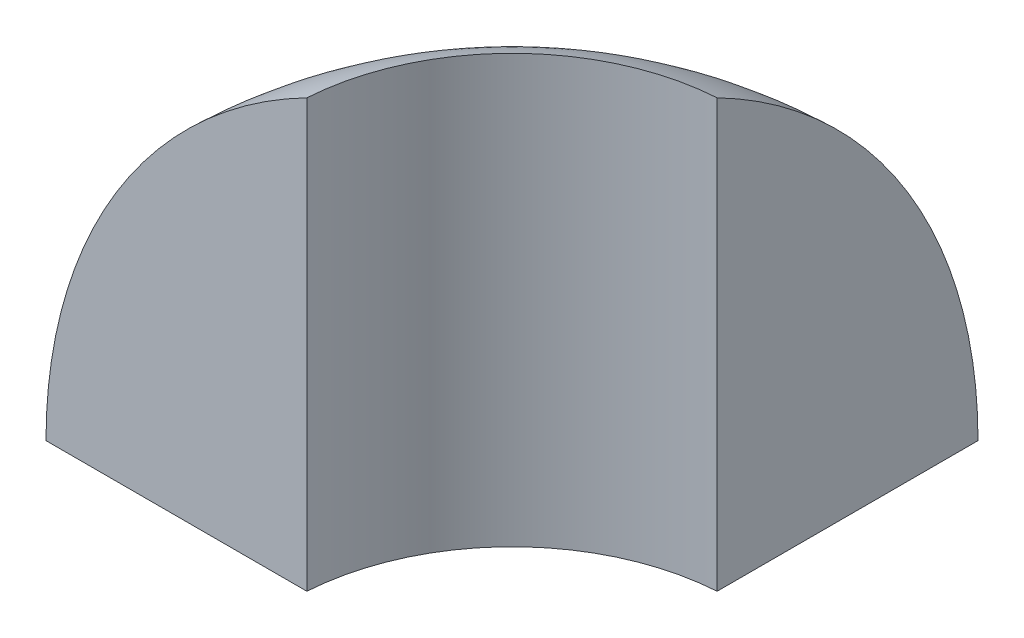
ISO-10303-21;
HEADER;
FILE_DESCRIPTION(('STEP AP214'),'2;1');
FILE_NAME('part.step','',(''),(''),'','','');
FILE_SCHEMA(('AUTOMOTIVE_DESIGN { 1 0 10303 214 1 1 1 1 }'));
ENDSEC;
DATA;
#1=APPLICATION_CONTEXT('core data for automotive mechanical design processes');
#2=APPLICATION_PROTOCOL_DEFINITION('international standard','automotive_design',2000,#1);
#3=PRODUCT_CONTEXT('',#1,'mechanical');
#4=PRODUCT('Part','Part','',(#3));
#5=PRODUCT_RELATED_PRODUCT_CATEGORY('part','',(#4));
#6=PRODUCT_DEFINITION_FORMATION('','',#4);
#7=PRODUCT_DEFINITION_CONTEXT('part definition',#1,'design');
#8=PRODUCT_DEFINITION('design','',#6,#7);
#9=PRODUCT_DEFINITION_SHAPE('','',#8);
#10=(LENGTH_UNIT() NAMED_UNIT(*) SI_UNIT(.MILLI.,.METRE.));
#11=(NAMED_UNIT(*) PLANE_ANGLE_UNIT() SI_UNIT($,.RADIAN.));
#12=(NAMED_UNIT(*) SI_UNIT($,.STERADIAN.) SOLID_ANGLE_UNIT());
#13=UNCERTAINTY_MEASURE_WITH_UNIT(LENGTH_MEASURE(1.E-05),#10,'distance_accuracy_value','');
#14=(GEOMETRIC_REPRESENTATION_CONTEXT(3) GLOBAL_UNCERTAINTY_ASSIGNED_CONTEXT((#13)) GLOBAL_UNIT_ASSIGNED_CONTEXT((#10,
#11,#12)) REPRESENTATION_CONTEXT('',''));
#15=CARTESIAN_POINT('',(0.,0.,0.));
#16=DIRECTION('',(0.,0.,1.));
#17=DIRECTION('',(1.,0.,0.));
#18=AXIS2_PLACEMENT_3D('',#15,#16,#17);
#19=CARTESIAN_POINT('',(0.,0.,0.));
#20=DIRECTION('',(0.,1.,0.));
#21=DIRECTION('',(1.,0.,0.));
#22=AXIS2_PLACEMENT_3D('',#19,#20,#21);
#23=SPHERICAL_SURFACE('',#22,16.6);
#24=CARTESIAN_POINT('',(0.,14.7580486514986,0.));
#25=DIRECTION('',(0.,-1.,0.));
#26=DIRECTION('',(0.,0.,-1.));
#27=AXIS2_PLACEMENT_3D('',#24,#25,#26);
#28=CIRCLE('',#27,7.6);
#29=CARTESIAN_POINT('',(-0.499999999999999,14.7580486514986,-7.58353479585872));
#30=VERTEX_POINT('',#29);
#31=CARTESIAN_POINT('',(-7.58353479585872,14.7580486514986,-0.499999999999999));
#32=VERTEX_POINT('',#31);
#33=EDGE_CURVE('E84',#30,#32,#28,.F.);
#34=ORIENTED_EDGE('',*,*,#33,.F.);
#35=CARTESIAN_POINT('',(-0.499999999999998,0.,0.));
#36=DIRECTION('',(-1.,0.,0.));
#37=DIRECTION('',(0.,0.,1.));
#38=AXIS2_PLACEMENT_3D('',#35,#36,#37);
#39=CIRCLE('',#38,16.5924681708298);
#40=CARTESIAN_POINT('',(-0.5,0.,-16.5924681708298));
#41=VERTEX_POINT('',#40);
#42=EDGE_CURVE('E82',#41,#30,#39,.F.);
#43=ORIENTED_EDGE('',*,*,#42,.F.);
#44=CARTESIAN_POINT('',(0.,0.,0.));
#45=DIRECTION('',(0.,1.,0.));
#46=DIRECTION('',(0.,0.,1.));
#47=AXIS2_PLACEMENT_3D('',#44,#45,#46);
#48=CIRCLE('',#47,16.6);
#49=CARTESIAN_POINT('',(-16.5924681708298,0.,-0.499999999999998));
#50=VERTEX_POINT('',#49);
#51=EDGE_CURVE('E88',#50,#41,#48,.F.);
#52=ORIENTED_EDGE('',*,*,#51,.F.);
#53=CARTESIAN_POINT('',(0.,0.,-0.5));
#54=DIRECTION('',(0.,0.,-1.));
#55=DIRECTION('',(-1.,0.,0.));
#56=AXIS2_PLACEMENT_3D('',#53,#54,#55);
#57=CIRCLE('',#56,16.5924681708298);
#58=EDGE_CURVE('E47',#32,#50,#57,.F.);
#59=ORIENTED_EDGE('',*,*,#58,.F.);
#60=EDGE_LOOP('',(#34,#43,#52,#59));
#61=FACE_BOUND('',#60,.T.);
#62=ADVANCED_FACE('F39',(#61),#23,.T.);
#63=CARTESIAN_POINT('',(-0.499999999999998,-16.6,-0.5));
#64=DIRECTION('',(0.,0.,-1.));
#65=DIRECTION('',(-1.,0.,0.));
#66=AXIS2_PLACEMENT_3D('',#63,#64,#65);
#67=PLANE('',#66);
#68=DIRECTION('',(1.,0.,0.));
#69=VECTOR('',#68,1.);
#70=CARTESIAN_POINT('',(-0.499999999999998,0.,-0.5));
#71=LINE('',#70,#69);
#72=CARTESIAN_POINT('',(-7.58353479585872,0.,-0.499999999999999));
#73=VERTEX_POINT('',#72);
#74=EDGE_CURVE('E89',#50,#73,#71,.T.);
#75=ORIENTED_EDGE('',*,*,#74,.T.);
#76=DIRECTION('',(0.,-1.,0.));
#77=VECTOR('',#76,1.);
#78=CARTESIAN_POINT('',(-7.58353479585872,16.5849329211788,-0.499999999999999));
#79=LINE('',#78,#77);
#80=EDGE_CURVE('E54',#73,#32,#79,.F.);
#81=ORIENTED_EDGE('',*,*,#80,.T.);
#82=ORIENTED_EDGE('',*,*,#58,.T.);
#83=EDGE_LOOP('',(#75,#81,#82));
#84=FACE_BOUND('',#83,.T.);
#85=ADVANCED_FACE('F104',(#84),#67,.F.);
#86=CARTESIAN_POINT('',(-0.5,-16.6,-16.5924681708298));
#87=DIRECTION('',(-1.,0.,0.));
#88=DIRECTION('',(0.,0.,1.));
#89=AXIS2_PLACEMENT_3D('',#86,#87,#88);
#90=PLANE('',#89);
#91=ORIENTED_EDGE('',*,*,#42,.T.);
#92=DIRECTION('',(0.,-1.,0.));
#93=VECTOR('',#92,1.);
#94=CARTESIAN_POINT('',(-0.499999999999999,16.5849329211788,-7.58353479585872));
#95=LINE('',#94,#93);
#96=CARTESIAN_POINT('',(-0.499999999999999,0.,-7.58353479585872));
#97=VERTEX_POINT('',#96);
#98=EDGE_CURVE('E73',#30,#97,#95,.T.);
#99=ORIENTED_EDGE('',*,*,#98,.T.);
#100=DIRECTION('',(0.,0.,-1.));
#101=VECTOR('',#100,1.);
#102=CARTESIAN_POINT('',(-0.5,0.,-16.5924681708298));
#103=LINE('',#102,#101);
#104=EDGE_CURVE('E11',#97,#41,#103,.T.);
#105=ORIENTED_EDGE('',*,*,#104,.T.);
#106=EDGE_LOOP('',(#91,#99,#105));
#107=FACE_BOUND('',#106,.T.);
#108=ADVANCED_FACE('F80',(#107),#90,.F.);
#109=CARTESIAN_POINT('',(-16.5924681708298,0.,0.));
#110=DIRECTION('',(0.,1.,0.));
#111=DIRECTION('',(0.,0.,1.));
#112=AXIS2_PLACEMENT_3D('',#109,#110,#111);
#113=PLANE('',#112);
#114=ORIENTED_EDGE('',*,*,#104,.F.);
#115=CARTESIAN_POINT('',(0.,0.,0.));
#116=DIRECTION('',(0.,-1.,0.));
#117=DIRECTION('',(0.,0.,-1.));
#118=AXIS2_PLACEMENT_3D('',#115,#116,#117);
#119=CIRCLE('',#118,7.6);
#120=EDGE_CURVE('E71',#73,#97,#119,.T.);
#121=ORIENTED_EDGE('',*,*,#120,.F.);
#122=ORIENTED_EDGE('',*,*,#74,.F.);
#123=ORIENTED_EDGE('',*,*,#51,.T.);
#124=EDGE_LOOP('',(#114,#121,#122,#123));
#125=FACE_BOUND('',#124,.T.);
#126=ADVANCED_FACE('F86',(#125),#113,.F.);
#127=CARTESIAN_POINT('',(0.,16.5849329211788,0.));
#128=DIRECTION('',(0.,-1.,0.));
#129=DIRECTION('',(0.,0.,-1.));
#130=AXIS2_PLACEMENT_3D('',#127,#128,#129);
#131=CYLINDRICAL_SURFACE('',#130,7.6);
#132=ORIENTED_EDGE('',*,*,#120,.T.);
#133=ORIENTED_EDGE('',*,*,#98,.F.);
#134=ORIENTED_EDGE('',*,*,#33,.T.);
#135=ORIENTED_EDGE('',*,*,#80,.F.);
#136=EDGE_LOOP('',(#132,#133,#134,#135));
#137=FACE_BOUND('',#136,.T.);
#138=ADVANCED_FACE('F72',(#137),#131,.F.);
#139=CLOSED_SHELL('',(#62,#85,#108,#126,#138));
#140=MANIFOLD_SOLID_BREP('B2',#139);
#141=ADVANCED_BREP_SHAPE_REPRESENTATION('',(#18,#140),#14);
#142=SHAPE_DEFINITION_REPRESENTATION(#9,#141);
ENDSEC;
END-ISO-10303-21;
